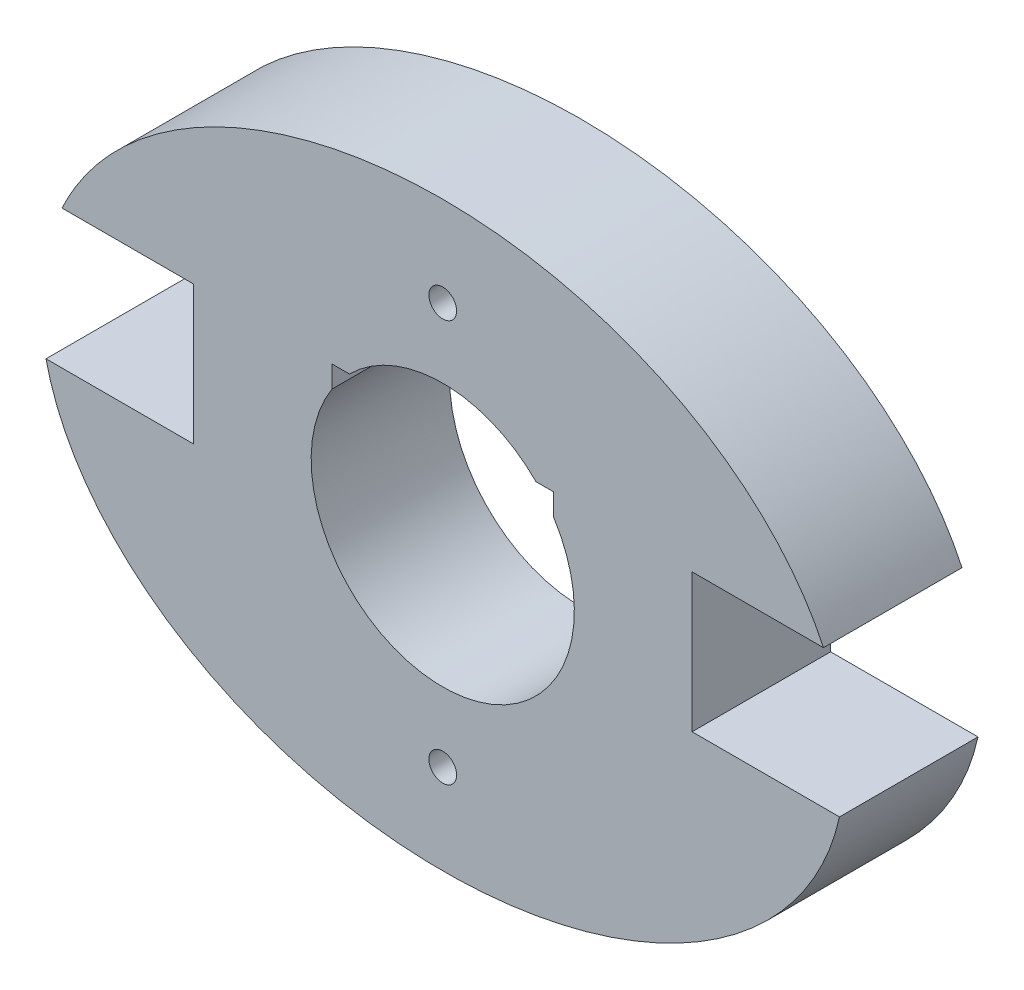
ISO-10303-21;
HEADER;
FILE_DESCRIPTION(('STEP AP214'),'2;1');
FILE_NAME('part.step','',(''),(''),'','','');
FILE_SCHEMA(('AUTOMOTIVE_DESIGN { 1 0 10303 214 1 1 1 1 }'));
ENDSEC;
DATA;
#1=APPLICATION_CONTEXT('core data for automotive mechanical design processes');
#2=APPLICATION_PROTOCOL_DEFINITION('international standard','automotive_design',2000,#1);
#3=PRODUCT_CONTEXT('',#1,'mechanical');
#4=PRODUCT('Part','Part','',(#3));
#5=PRODUCT_RELATED_PRODUCT_CATEGORY('part','',(#4));
#6=PRODUCT_DEFINITION_FORMATION('','',#4);
#7=PRODUCT_DEFINITION_CONTEXT('part definition',#1,'design');
#8=PRODUCT_DEFINITION('design','',#6,#7);
#9=PRODUCT_DEFINITION_SHAPE('','',#8);
#10=(LENGTH_UNIT() NAMED_UNIT(*) SI_UNIT(.MILLI.,.METRE.));
#11=(NAMED_UNIT(*) PLANE_ANGLE_UNIT() SI_UNIT($,.RADIAN.));
#12=(NAMED_UNIT(*) SI_UNIT($,.STERADIAN.) SOLID_ANGLE_UNIT());
#13=UNCERTAINTY_MEASURE_WITH_UNIT(LENGTH_MEASURE(1.E-05),#10,'distance_accuracy_value','');
#14=(GEOMETRIC_REPRESENTATION_CONTEXT(3) GLOBAL_UNCERTAINTY_ASSIGNED_CONTEXT((#13)) GLOBAL_UNIT_ASSIGNED_CONTEXT((#10,
#11,#12)) REPRESENTATION_CONTEXT('',''));
#15=CARTESIAN_POINT('',(0.,0.,0.));
#16=DIRECTION('',(0.,0.,1.));
#17=DIRECTION('',(1.,0.,0.));
#18=AXIS2_PLACEMENT_3D('',#15,#16,#17);
#19=CARTESIAN_POINT('',(0.,0.,5.));
#20=DIRECTION('',(0.,0.,-1.));
#21=DIRECTION('',(-1.,0.,0.));
#22=AXIS2_PLACEMENT_3D('',#19,#20,#21);
#23=CYLINDRICAL_SURFACE('',#22,4.75000000000001);
#24=DIRECTION('',(0.,0.,-1.));
#25=VECTOR('',#24,1.);
#26=CARTESIAN_POINT('',(3.36749164809657,3.35,5.));
#27=LINE('',#26,#25);
#28=CARTESIAN_POINT('',(3.36749164809657,3.35,5.));
#29=VERTEX_POINT('',#28);
#30=CARTESIAN_POINT('',(3.36749164809657,3.35,0.));
#31=VERTEX_POINT('',#30);
#32=EDGE_CURVE('E11',#29,#31,#27,.T.);
#33=ORIENTED_EDGE('',*,*,#32,.F.);
#34=CARTESIAN_POINT('',(0.,0.,5.));
#35=DIRECTION('',(0.,0.,1.));
#36=DIRECTION('',(1.,0.,0.));
#37=AXIS2_PLACEMENT_3D('',#34,#35,#36);
#38=CIRCLE('',#37,4.75000000000001);
#39=CARTESIAN_POINT('',(-3.36749164809657,3.35,5.));
#40=VERTEX_POINT('',#39);
#41=EDGE_CURVE('E156',#29,#40,#38,.T.);
#42=ORIENTED_EDGE('',*,*,#41,.T.);
#43=DIRECTION('',(0.,0.,-1.));
#44=VECTOR('',#43,1.);
#45=CARTESIAN_POINT('',(-3.36749164809657,3.35,5.));
#46=LINE('',#45,#44);
#47=CARTESIAN_POINT('',(-3.36749164809657,3.35,0.));
#48=VERTEX_POINT('',#47);
#49=EDGE_CURVE('E42',#48,#40,#46,.F.);
#50=ORIENTED_EDGE('',*,*,#49,.F.);
#51=CARTESIAN_POINT('',(0.,0.,0.));
#52=DIRECTION('',(0.,0.,1.));
#53=DIRECTION('',(1.,0.,0.));
#54=AXIS2_PLACEMENT_3D('',#51,#52,#53);
#55=CIRCLE('',#54,4.75000000000001);
#56=EDGE_CURVE('E170',#31,#48,#55,.T.);
#57=ORIENTED_EDGE('',*,*,#56,.F.);
#58=EDGE_LOOP('',(#33,#42,#50,#57));
#59=FACE_BOUND('',#58,.T.);
#60=ADVANCED_FACE('F33',(#59),#23,.F.);
#61=CARTESIAN_POINT('',(0.,0.,5.));
#62=DIRECTION('',(0.,0.,-1.));
#63=DIRECTION('',(-1.,0.,0.));
#64=AXIS2_PLACEMENT_3D('',#61,#62,#63);
#65=PLANE('',#64);
#66=CARTESIAN_POINT('',(0.,-7.25449999999413,5.));
#67=DIRECTION('',(0.,0.,1.));
#68=DIRECTION('',(1.,0.,0.));
#69=AXIS2_PLACEMENT_3D('',#66,#67,#68);
#70=CIRCLE('',#69,0.499999999997022);
#71=CARTESIAN_POINT('',(0.499999999997022,-7.25449999999413,5.));
#72=VERTEX_POINT('',#71);
#73=EDGE_CURVE('E173',#72,#72,#70,.T.);
#74=ORIENTED_EDGE('',*,*,#73,.F.);
#75=EDGE_LOOP('',(#74));
#76=FACE_BOUND('',#75,.T.);
#77=CARTESIAN_POINT('',(0.,0.,5.));
#78=DIRECTION('',(0.,0.,1.));
#79=DIRECTION('',(1.,0.,0.));
#80=AXIS2_PLACEMENT_3D('',#77,#78,#79);
#81=ELLIPSE('',#80,14.5,10.5);
#82=CARTESIAN_POINT('',(13.7422109457687,3.34999999999995,5.));
#83=VERTEX_POINT('',#82);
#84=CARTESIAN_POINT('',(-13.7422109457687,3.34999999999995,5.));
#85=VERTEX_POINT('',#84);
#86=EDGE_CURVE('E185',#83,#85,#81,.T.);
#87=ORIENTED_EDGE('',*,*,#86,.T.);
#88=DIRECTION('',(1.,0.,0.));
#89=VECTOR('',#88,1.);
#90=CARTESIAN_POINT('',(-13.7422109457687,3.34999999999995,5.));
#91=LINE('',#90,#89);
#92=CARTESIAN_POINT('',(-9.,3.35,5.));
#93=VERTEX_POINT('',#92);
#94=EDGE_CURVE('E189',#85,#93,#91,.T.);
#95=ORIENTED_EDGE('',*,*,#94,.T.);
#96=DIRECTION('',(0.,-1.,0.));
#97=VECTOR('',#96,1.);
#98=CARTESIAN_POINT('',(-9.,3.35,5.));
#99=LINE('',#98,#97);
#100=CARTESIAN_POINT('',(-9.,-1.65000000000001,5.));
#101=VERTEX_POINT('',#100);
#102=EDGE_CURVE('E192',#93,#101,#99,.T.);
#103=ORIENTED_EDGE('',*,*,#102,.T.);
#104=DIRECTION('',(-1.,0.,0.));
#105=VECTOR('',#104,1.);
#106=CARTESIAN_POINT('',(-14.3198502870979,-1.65000000000001,5.));
#107=LINE('',#106,#105);
#108=CARTESIAN_POINT('',(-14.3198502870979,-1.65000000000001,5.));
#109=VERTEX_POINT('',#108);
#110=EDGE_CURVE('E194',#101,#109,#107,.T.);
#111=ORIENTED_EDGE('',*,*,#110,.T.);
#112=CARTESIAN_POINT('',(0.,0.,5.));
#113=DIRECTION('',(0.,0.,1.));
#114=DIRECTION('',(1.,0.,0.));
#115=AXIS2_PLACEMENT_3D('',#112,#113,#114);
#116=ELLIPSE('',#115,14.5,10.5);
#117=CARTESIAN_POINT('',(14.3198502870979,-1.65,5.));
#118=VERTEX_POINT('',#117);
#119=EDGE_CURVE('E196',#109,#118,#116,.T.);
#120=ORIENTED_EDGE('',*,*,#119,.T.);
#121=DIRECTION('',(-1.,0.,0.));
#122=VECTOR('',#121,1.);
#123=CARTESIAN_POINT('',(14.3198502870979,-1.65,5.));
#124=LINE('',#123,#122);
#125=CARTESIAN_POINT('',(9.,-1.65,5.));
#126=VERTEX_POINT('',#125);
#127=EDGE_CURVE('E199',#118,#126,#124,.T.);
#128=ORIENTED_EDGE('',*,*,#127,.T.);
#129=DIRECTION('',(0.,1.,0.));
#130=VECTOR('',#129,1.);
#131=CARTESIAN_POINT('',(9.,3.35,5.));
#132=LINE('',#131,#130);
#133=CARTESIAN_POINT('',(9.,3.35,5.));
#134=VERTEX_POINT('',#133);
#135=EDGE_CURVE('E301',#126,#134,#132,.T.);
#136=ORIENTED_EDGE('',*,*,#135,.T.);
#137=DIRECTION('',(1.,0.,0.));
#138=VECTOR('',#137,1.);
#139=CARTESIAN_POINT('',(13.7422109457687,3.34999999999995,5.));
#140=LINE('',#139,#138);
#141=EDGE_CURVE('E285',#134,#83,#140,.T.);
#142=ORIENTED_EDGE('',*,*,#141,.T.);
#143=EDGE_LOOP('',(#87,#95,#103,#111,#120,#128,#136,#142));
#144=FACE_BOUND('',#143,.T.);
#145=CARTESIAN_POINT('',(3.11417199942654E-12,7.25450000000587,5.));
#146=DIRECTION('',(0.,0.,1.));
#147=DIRECTION('',(1.,0.,0.));
#148=AXIS2_PLACEMENT_3D('',#145,#146,#147);
#149=CIRCLE('',#148,0.5);
#150=CARTESIAN_POINT('',(0.500000000003114,7.25450000000587,5.));
#151=VERTEX_POINT('',#150);
#152=EDGE_CURVE('E180',#151,#151,#149,.T.);
#153=ORIENTED_EDGE('',*,*,#152,.F.);
#154=EDGE_LOOP('',(#153));
#155=FACE_BOUND('',#154,.T.);
#156=DIRECTION('',(0.,1.,0.));
#157=VECTOR('',#156,1.);
#158=CARTESIAN_POINT('',(-4.,3.35,5.));
#159=LINE('',#158,#157);
#160=CARTESIAN_POINT('',(-4.,2.56173769148993,5.));
#161=VERTEX_POINT('',#160);
#162=CARTESIAN_POINT('',(-4.,3.35,5.));
#163=VERTEX_POINT('',#162);
#164=EDGE_CURVE('E57',#161,#163,#159,.T.);
#165=ORIENTED_EDGE('',*,*,#164,.T.);
#166=DIRECTION('',(1.,0.,0.));
#167=VECTOR('',#166,1.);
#168=CARTESIAN_POINT('',(-4.,3.35,5.));
#169=LINE('',#168,#167);
#170=EDGE_CURVE('E150',#163,#40,#169,.T.);
#171=ORIENTED_EDGE('',*,*,#170,.T.);
#172=ORIENTED_EDGE('',*,*,#41,.F.);
#173=CARTESIAN_POINT('',(4.,3.35,5.));
#174=VERTEX_POINT('',#173);
#175=EDGE_CURVE('E137',#29,#174,#169,.T.);
#176=ORIENTED_EDGE('',*,*,#175,.T.);
#177=DIRECTION('',(0.,-1.,0.));
#178=VECTOR('',#177,1.);
#179=CARTESIAN_POINT('',(4.,3.35,5.));
#180=LINE('',#179,#178);
#181=CARTESIAN_POINT('',(4.,2.56173769148993,5.));
#182=VERTEX_POINT('',#181);
#183=EDGE_CURVE('E144',#174,#182,#180,.T.);
#184=ORIENTED_EDGE('',*,*,#183,.T.);
#185=EDGE_CURVE('E168',#161,#182,#38,.T.);
#186=ORIENTED_EDGE('',*,*,#185,.F.);
#187=EDGE_LOOP('',(#165,#171,#172,#176,#184,#186));
#188=FACE_BOUND('',#187,.T.);
#189=ADVANCED_FACE('F153',(#76,#144,#155,#188),#65,.F.);
#190=CARTESIAN_POINT('',(0.,0.,0.));
#191=DIRECTION('',(0.,0.,-1.));
#192=DIRECTION('',(-1.,0.,0.));
#193=AXIS2_PLACEMENT_3D('',#190,#191,#192);
#194=PLANE('',#193);
#195=DIRECTION('',(1.,0.,0.));
#196=VECTOR('',#195,1.);
#197=CARTESIAN_POINT('',(-4.,3.35,0.));
#198=LINE('',#197,#196);
#199=CARTESIAN_POINT('',(-4.,3.35,0.));
#200=VERTEX_POINT('',#199);
#201=EDGE_CURVE('E162',#200,#48,#198,.T.);
#202=ORIENTED_EDGE('',*,*,#201,.F.);
#203=DIRECTION('',(0.,1.,0.));
#204=VECTOR('',#203,1.);
#205=CARTESIAN_POINT('',(-4.,3.35,0.));
#206=LINE('',#205,#204);
#207=CARTESIAN_POINT('',(-4.,2.56173769148993,0.));
#208=VERTEX_POINT('',#207);
#209=EDGE_CURVE('E157',#208,#200,#206,.T.);
#210=ORIENTED_EDGE('',*,*,#209,.F.);
#211=CARTESIAN_POINT('',(4.,2.56173769148993,0.));
#212=VERTEX_POINT('',#211);
#213=EDGE_CURVE('E166',#208,#212,#55,.T.);
#214=ORIENTED_EDGE('',*,*,#213,.T.);
#215=DIRECTION('',(0.,-1.,0.));
#216=VECTOR('',#215,1.);
#217=CARTESIAN_POINT('',(4.,3.35,0.));
#218=LINE('',#217,#216);
#219=CARTESIAN_POINT('',(4.,3.35,0.));
#220=VERTEX_POINT('',#219);
#221=EDGE_CURVE('E49',#220,#212,#218,.T.);
#222=ORIENTED_EDGE('',*,*,#221,.F.);
#223=EDGE_CURVE('E140',#31,#220,#198,.T.);
#224=ORIENTED_EDGE('',*,*,#223,.F.);
#225=ORIENTED_EDGE('',*,*,#56,.T.);
#226=EDGE_LOOP('',(#202,#210,#214,#222,#224,#225));
#227=FACE_BOUND('',#226,.T.);
#228=CARTESIAN_POINT('',(0.,-7.25449999999413,0.));
#229=DIRECTION('',(0.,0.,1.));
#230=DIRECTION('',(1.,0.,0.));
#231=AXIS2_PLACEMENT_3D('',#228,#229,#230);
#232=CIRCLE('',#231,0.499999999997022);
#233=CARTESIAN_POINT('',(0.499999999997022,-7.25449999999413,0.));
#234=VERTEX_POINT('',#233);
#235=EDGE_CURVE('E177',#234,#234,#232,.T.);
#236=ORIENTED_EDGE('',*,*,#235,.T.);
#237=EDGE_LOOP('',(#236));
#238=FACE_BOUND('',#237,.T.);
#239=CARTESIAN_POINT('',(0.,0.,0.));
#240=DIRECTION('',(0.,0.,1.));
#241=DIRECTION('',(1.,0.,0.));
#242=AXIS2_PLACEMENT_3D('',#239,#240,#241);
#243=ELLIPSE('',#242,14.5,10.5);
#244=CARTESIAN_POINT('',(13.7422109457687,3.34999999999995,0.));
#245=VERTEX_POINT('',#244);
#246=CARTESIAN_POINT('',(-13.7422109457687,3.34999999999995,0.));
#247=VERTEX_POINT('',#246);
#248=EDGE_CURVE('E183',#245,#247,#243,.T.);
#249=ORIENTED_EDGE('',*,*,#248,.F.);
#250=DIRECTION('',(1.,0.,0.));
#251=VECTOR('',#250,1.);
#252=CARTESIAN_POINT('',(13.7422109457687,3.34999999999995,0.));
#253=LINE('',#252,#251);
#254=CARTESIAN_POINT('',(9.,3.35,0.));
#255=VERTEX_POINT('',#254);
#256=EDGE_CURVE('E190',#255,#245,#253,.T.);
#257=ORIENTED_EDGE('',*,*,#256,.F.);
#258=DIRECTION('',(0.,1.,0.));
#259=VECTOR('',#258,1.);
#260=CARTESIAN_POINT('',(9.,3.35,0.));
#261=LINE('',#260,#259);
#262=CARTESIAN_POINT('',(9.,-1.65,0.));
#263=VERTEX_POINT('',#262);
#264=EDGE_CURVE('E287',#263,#255,#261,.T.);
#265=ORIENTED_EDGE('',*,*,#264,.F.);
#266=DIRECTION('',(-1.,0.,0.));
#267=VECTOR('',#266,1.);
#268=CARTESIAN_POINT('',(14.3198502870979,-1.65,0.));
#269=LINE('',#268,#267);
#270=CARTESIAN_POINT('',(14.3198502870979,-1.65,0.));
#271=VERTEX_POINT('',#270);
#272=EDGE_CURVE('E289',#271,#263,#269,.T.);
#273=ORIENTED_EDGE('',*,*,#272,.F.);
#274=CARTESIAN_POINT('',(0.,0.,0.));
#275=DIRECTION('',(0.,0.,1.));
#276=DIRECTION('',(1.,0.,0.));
#277=AXIS2_PLACEMENT_3D('',#274,#275,#276);
#278=ELLIPSE('',#277,14.5,10.5);
#279=CARTESIAN_POINT('',(-14.3198502870979,-1.65000000000001,0.));
#280=VERTEX_POINT('',#279);
#281=EDGE_CURVE('E291',#280,#271,#278,.T.);
#282=ORIENTED_EDGE('',*,*,#281,.F.);
#283=DIRECTION('',(-1.,0.,0.));
#284=VECTOR('',#283,1.);
#285=CARTESIAN_POINT('',(-14.3198502870979,-1.65000000000001,0.));
#286=LINE('',#285,#284);
#287=CARTESIAN_POINT('',(-9.,-1.65000000000001,0.));
#288=VERTEX_POINT('',#287);
#289=EDGE_CURVE('E293',#288,#280,#286,.T.);
#290=ORIENTED_EDGE('',*,*,#289,.F.);
#291=DIRECTION('',(0.,-1.,0.));
#292=VECTOR('',#291,1.);
#293=CARTESIAN_POINT('',(-9.,3.35,0.));
#294=LINE('',#293,#292);
#295=CARTESIAN_POINT('',(-9.,3.35,0.));
#296=VERTEX_POINT('',#295);
#297=EDGE_CURVE('E295',#296,#288,#294,.T.);
#298=ORIENTED_EDGE('',*,*,#297,.F.);
#299=DIRECTION('',(1.,0.,0.));
#300=VECTOR('',#299,1.);
#301=CARTESIAN_POINT('',(-13.7422109457687,3.34999999999995,0.));
#302=LINE('',#301,#300);
#303=EDGE_CURVE('E297',#247,#296,#302,.T.);
#304=ORIENTED_EDGE('',*,*,#303,.F.);
#305=EDGE_LOOP('',(#249,#257,#265,#273,#282,#290,#298,#304));
#306=FACE_BOUND('',#305,.T.);
#307=CARTESIAN_POINT('',(3.11417199942654E-12,7.25450000000587,0.));
#308=DIRECTION('',(0.,0.,1.));
#309=DIRECTION('',(1.,0.,0.));
#310=AXIS2_PLACEMENT_3D('',#307,#308,#309);
#311=CIRCLE('',#310,0.5);
#312=CARTESIAN_POINT('',(0.500000000003114,7.25450000000587,0.));
#313=VERTEX_POINT('',#312);
#314=EDGE_CURVE('E176',#313,#313,#311,.T.);
#315=ORIENTED_EDGE('',*,*,#314,.T.);
#316=EDGE_LOOP('',(#315));
#317=FACE_BOUND('',#316,.T.);
#318=ADVANCED_FACE('F222',(#227,#238,#306,#317),#194,.T.);
#319=DIRECTION('',(0.,0.,-1.));
#320=VECTOR('',#319,1.);
#321=SURFACE_OF_LINEAR_EXTRUSION('',#81,#320);
#322=ORIENTED_EDGE('',*,*,#248,.T.);
#323=DIRECTION('',(0.,0.,-1.));
#324=VECTOR('',#323,1.);
#325=CARTESIAN_POINT('',(-13.7422109457687,3.34999999999995,5.));
#326=LINE('',#325,#324);
#327=EDGE_CURVE('E261',#85,#247,#326,.T.);
#328=ORIENTED_EDGE('',*,*,#327,.F.);
#329=ORIENTED_EDGE('',*,*,#86,.F.);
#330=DIRECTION('',(0.,0.,-1.));
#331=VECTOR('',#330,1.);
#332=CARTESIAN_POINT('',(13.7422109457687,3.34999999999995,5.));
#333=LINE('',#332,#331);
#334=EDGE_CURVE('E282',#83,#245,#333,.T.);
#335=ORIENTED_EDGE('',*,*,#334,.T.);
#336=EDGE_LOOP('',(#322,#328,#329,#335));
#337=FACE_BOUND('',#336,.T.);
#338=ADVANCED_FACE('F35',(#337),#321,.F.);
#339=CARTESIAN_POINT('',(-13.7422109457687,3.34999999999995,5.));
#340=DIRECTION('',(0.,1.,0.));
#341=DIRECTION('',(-1.,0.,0.));
#342=AXIS2_PLACEMENT_3D('',#339,#340,#341);
#343=PLANE('',#342);
#344=ORIENTED_EDGE('',*,*,#303,.T.);
#345=DIRECTION('',(0.,0.,-1.));
#346=VECTOR('',#345,1.);
#347=CARTESIAN_POINT('',(-9.,3.35,5.));
#348=LINE('',#347,#346);
#349=EDGE_CURVE('E264',#93,#296,#348,.T.);
#350=ORIENTED_EDGE('',*,*,#349,.F.);
#351=ORIENTED_EDGE('',*,*,#94,.F.);
#352=ORIENTED_EDGE('',*,*,#327,.T.);
#353=EDGE_LOOP('',(#344,#350,#351,#352));
#354=FACE_BOUND('',#353,.T.);
#355=ADVANCED_FACE('F215',(#354),#343,.F.);
#356=CARTESIAN_POINT('',(-9.,3.35,5.));
#357=DIRECTION('',(1.,0.,0.));
#358=DIRECTION('',(0.,1.,0.));
#359=AXIS2_PLACEMENT_3D('',#356,#357,#358);
#360=PLANE('',#359);
#361=ORIENTED_EDGE('',*,*,#297,.T.);
#362=DIRECTION('',(0.,0.,-1.));
#363=VECTOR('',#362,1.);
#364=CARTESIAN_POINT('',(-9.,-1.65000000000001,5.));
#365=LINE('',#364,#363);
#366=EDGE_CURVE('E267',#101,#288,#365,.T.);
#367=ORIENTED_EDGE('',*,*,#366,.F.);
#368=ORIENTED_EDGE('',*,*,#102,.F.);
#369=ORIENTED_EDGE('',*,*,#349,.T.);
#370=EDGE_LOOP('',(#361,#367,#368,#369));
#371=FACE_BOUND('',#370,.T.);
#372=ADVANCED_FACE('F212',(#371),#360,.F.);
#373=CARTESIAN_POINT('',(-14.3198502870979,-1.65000000000001,5.));
#374=DIRECTION('',(0.,-1.,0.));
#375=DIRECTION('',(1.,0.,0.));
#376=AXIS2_PLACEMENT_3D('',#373,#374,#375);
#377=PLANE('',#376);
#378=ORIENTED_EDGE('',*,*,#289,.T.);
#379=DIRECTION('',(0.,0.,-1.));
#380=VECTOR('',#379,1.);
#381=CARTESIAN_POINT('',(-14.3198502870979,-1.65000000000001,5.));
#382=LINE('',#381,#380);
#383=EDGE_CURVE('E270',#109,#280,#382,.T.);
#384=ORIENTED_EDGE('',*,*,#383,.F.);
#385=ORIENTED_EDGE('',*,*,#110,.F.);
#386=ORIENTED_EDGE('',*,*,#366,.T.);
#387=EDGE_LOOP('',(#378,#384,#385,#386));
#388=FACE_BOUND('',#387,.T.);
#389=ADVANCED_FACE('F207',(#388),#377,.F.);
#390=DIRECTION('',(0.,0.,-1.));
#391=VECTOR('',#390,1.);
#392=SURFACE_OF_LINEAR_EXTRUSION('',#116,#391);
#393=ORIENTED_EDGE('',*,*,#281,.T.);
#394=DIRECTION('',(0.,0.,-1.));
#395=VECTOR('',#394,1.);
#396=CARTESIAN_POINT('',(14.3198502870979,-1.65,5.));
#397=LINE('',#396,#395);
#398=EDGE_CURVE('E273',#118,#271,#397,.T.);
#399=ORIENTED_EDGE('',*,*,#398,.F.);
#400=ORIENTED_EDGE('',*,*,#119,.F.);
#401=ORIENTED_EDGE('',*,*,#383,.T.);
#402=EDGE_LOOP('',(#393,#399,#400,#401));
#403=FACE_BOUND('',#402,.T.);
#404=ADVANCED_FACE('F202',(#403),#392,.F.);
#405=CARTESIAN_POINT('',(14.3198502870979,-1.65,5.));
#406=DIRECTION('',(0.,-1.,0.));
#407=DIRECTION('',(1.,0.,0.));
#408=AXIS2_PLACEMENT_3D('',#405,#406,#407);
#409=PLANE('',#408);
#410=ORIENTED_EDGE('',*,*,#272,.T.);
#411=DIRECTION('',(0.,0.,-1.));
#412=VECTOR('',#411,1.);
#413=CARTESIAN_POINT('',(9.,-1.65,5.));
#414=LINE('',#413,#412);
#415=EDGE_CURVE('E276',#126,#263,#414,.T.);
#416=ORIENTED_EDGE('',*,*,#415,.F.);
#417=ORIENTED_EDGE('',*,*,#127,.F.);
#418=ORIENTED_EDGE('',*,*,#398,.T.);
#419=EDGE_LOOP('',(#410,#416,#417,#418));
#420=FACE_BOUND('',#419,.T.);
#421=ADVANCED_FACE('F206',(#420),#409,.F.);
#422=CARTESIAN_POINT('',(9.,3.35,5.));
#423=DIRECTION('',(-1.,0.,0.));
#424=DIRECTION('',(0.,-1.,0.));
#425=AXIS2_PLACEMENT_3D('',#422,#423,#424);
#426=PLANE('',#425);
#427=ORIENTED_EDGE('',*,*,#264,.T.);
#428=DIRECTION('',(0.,0.,-1.));
#429=VECTOR('',#428,1.);
#430=CARTESIAN_POINT('',(9.,3.35,5.));
#431=LINE('',#430,#429);
#432=EDGE_CURVE('E279',#134,#255,#431,.T.);
#433=ORIENTED_EDGE('',*,*,#432,.F.);
#434=ORIENTED_EDGE('',*,*,#135,.F.);
#435=ORIENTED_EDGE('',*,*,#415,.T.);
#436=EDGE_LOOP('',(#427,#433,#434,#435));
#437=FACE_BOUND('',#436,.T.);
#438=ADVANCED_FACE('F314',(#437),#426,.F.);
#439=CARTESIAN_POINT('',(13.7422109457687,3.34999999999995,5.));
#440=DIRECTION('',(0.,1.,0.));
#441=DIRECTION('',(-1.,0.,0.));
#442=AXIS2_PLACEMENT_3D('',#439,#440,#441);
#443=PLANE('',#442);
#444=ORIENTED_EDGE('',*,*,#256,.T.);
#445=ORIENTED_EDGE('',*,*,#334,.F.);
#446=ORIENTED_EDGE('',*,*,#141,.F.);
#447=ORIENTED_EDGE('',*,*,#432,.T.);
#448=EDGE_LOOP('',(#444,#445,#446,#447));
#449=FACE_BOUND('',#448,.T.);
#450=ADVANCED_FACE('F319',(#449),#443,.F.);
#451=CARTESIAN_POINT('',(3.11417199942654E-12,7.25450000000587,5.));
#452=DIRECTION('',(0.,0.,-1.));
#453=DIRECTION('',(-1.,0.,0.));
#454=AXIS2_PLACEMENT_3D('',#451,#452,#453);
#455=CYLINDRICAL_SURFACE('',#454,0.5);
#456=ORIENTED_EDGE('',*,*,#152,.T.);
#457=EDGE_LOOP('',(#456));
#458=FACE_BOUND('',#457,.T.);
#459=ORIENTED_EDGE('',*,*,#314,.F.);
#460=EDGE_LOOP('',(#459));
#461=FACE_BOUND('',#460,.T.);
#462=ADVANCED_FACE('F243',(#458,#461),#455,.F.);
#463=CARTESIAN_POINT('',(0.,-7.25449999999413,5.));
#464=DIRECTION('',(0.,0.,-1.));
#465=DIRECTION('',(-1.,0.,0.));
#466=AXIS2_PLACEMENT_3D('',#463,#464,#465);
#467=CYLINDRICAL_SURFACE('',#466,0.499999999997022);
#468=ORIENTED_EDGE('',*,*,#73,.T.);
#469=EDGE_LOOP('',(#468));
#470=FACE_BOUND('',#469,.T.);
#471=ORIENTED_EDGE('',*,*,#235,.F.);
#472=EDGE_LOOP('',(#471));
#473=FACE_BOUND('',#472,.T.);
#474=ADVANCED_FACE('F236',(#470,#473),#467,.F.);
#475=DIRECTION('',(0.,0.,-1.));
#476=VECTOR('',#475,1.);
#477=CARTESIAN_POINT('',(-4.,2.56173769148993,5.));
#478=LINE('',#477,#476);
#479=EDGE_CURVE('E246',#161,#208,#478,.T.);
#480=ORIENTED_EDGE('',*,*,#479,.F.);
#481=ORIENTED_EDGE('',*,*,#185,.T.);
#482=DIRECTION('',(0.,0.,-1.));
#483=VECTOR('',#482,1.);
#484=CARTESIAN_POINT('',(4.,2.56173769148993,5.));
#485=LINE('',#484,#483);
#486=EDGE_CURVE('E146',#212,#182,#485,.F.);
#487=ORIENTED_EDGE('',*,*,#486,.F.);
#488=ORIENTED_EDGE('',*,*,#213,.F.);
#489=EDGE_LOOP('',(#480,#481,#487,#488));
#490=FACE_BOUND('',#489,.T.);
#491=ADVANCED_FACE('F227',(#490),#23,.F.);
#492=CARTESIAN_POINT('',(4.,3.35,5.));
#493=DIRECTION('',(1.,0.,0.));
#494=DIRECTION('',(0.,0.,-1.));
#495=AXIS2_PLACEMENT_3D('',#492,#493,#494);
#496=PLANE('',#495);
#497=ORIENTED_EDGE('',*,*,#486,.T.);
#498=ORIENTED_EDGE('',*,*,#183,.F.);
#499=DIRECTION('',(0.,0.,-1.));
#500=VECTOR('',#499,1.);
#501=CARTESIAN_POINT('',(4.,3.35,5.));
#502=LINE('',#501,#500);
#503=EDGE_CURVE('E133',#174,#220,#502,.T.);
#504=ORIENTED_EDGE('',*,*,#503,.T.);
#505=ORIENTED_EDGE('',*,*,#221,.T.);
#506=EDGE_LOOP('',(#497,#498,#504,#505));
#507=FACE_BOUND('',#506,.T.);
#508=ADVANCED_FACE('F145',(#507),#496,.F.);
#509=CARTESIAN_POINT('',(-4.,3.35,5.));
#510=DIRECTION('',(0.,1.,0.));
#511=DIRECTION('',(0.,0.,1.));
#512=AXIS2_PLACEMENT_3D('',#509,#510,#511);
#513=PLANE('',#512);
#514=ORIENTED_EDGE('',*,*,#32,.T.);
#515=ORIENTED_EDGE('',*,*,#223,.T.);
#516=ORIENTED_EDGE('',*,*,#503,.F.);
#517=ORIENTED_EDGE('',*,*,#175,.F.);
#518=EDGE_LOOP('',(#514,#515,#516,#517));
#519=FACE_BOUND('',#518,.T.);
#520=ADVANCED_FACE('F135',(#519),#513,.F.);
#521=ORIENTED_EDGE('',*,*,#49,.T.);
#522=ORIENTED_EDGE('',*,*,#170,.F.);
#523=DIRECTION('',(0.,0.,-1.));
#524=VECTOR('',#523,1.);
#525=CARTESIAN_POINT('',(-4.,3.35,5.));
#526=LINE('',#525,#524);
#527=EDGE_CURVE('E141',#163,#200,#526,.T.);
#528=ORIENTED_EDGE('',*,*,#527,.T.);
#529=ORIENTED_EDGE('',*,*,#201,.T.);
#530=EDGE_LOOP('',(#521,#522,#528,#529));
#531=FACE_BOUND('',#530,.T.);
#532=ADVANCED_FACE('F258',(#531),#513,.F.);
#533=CARTESIAN_POINT('',(-4.,3.35,5.));
#534=DIRECTION('',(-1.,0.,0.));
#535=DIRECTION('',(0.,0.,1.));
#536=AXIS2_PLACEMENT_3D('',#533,#534,#535);
#537=PLANE('',#536);
#538=ORIENTED_EDGE('',*,*,#479,.T.);
#539=ORIENTED_EDGE('',*,*,#209,.T.);
#540=ORIENTED_EDGE('',*,*,#527,.F.);
#541=ORIENTED_EDGE('',*,*,#164,.F.);
#542=EDGE_LOOP('',(#538,#539,#540,#541));
#543=FACE_BOUND('',#542,.T.);
#544=ADVANCED_FACE('F257',(#543),#537,.F.);
#545=CLOSED_SHELL('',(#60,#189,#318,#338,#355,#372,#389,#404,#421,#438,#450,#462,#474,#491,#508,
#520,#532,#544));
#546=MANIFOLD_SOLID_BREP('B2',#545);
#547=ADVANCED_BREP_SHAPE_REPRESENTATION('',(#18,#546),#14);
#548=SHAPE_DEFINITION_REPRESENTATION(#9,#547);
ENDSEC;
END-ISO-10303-21;
